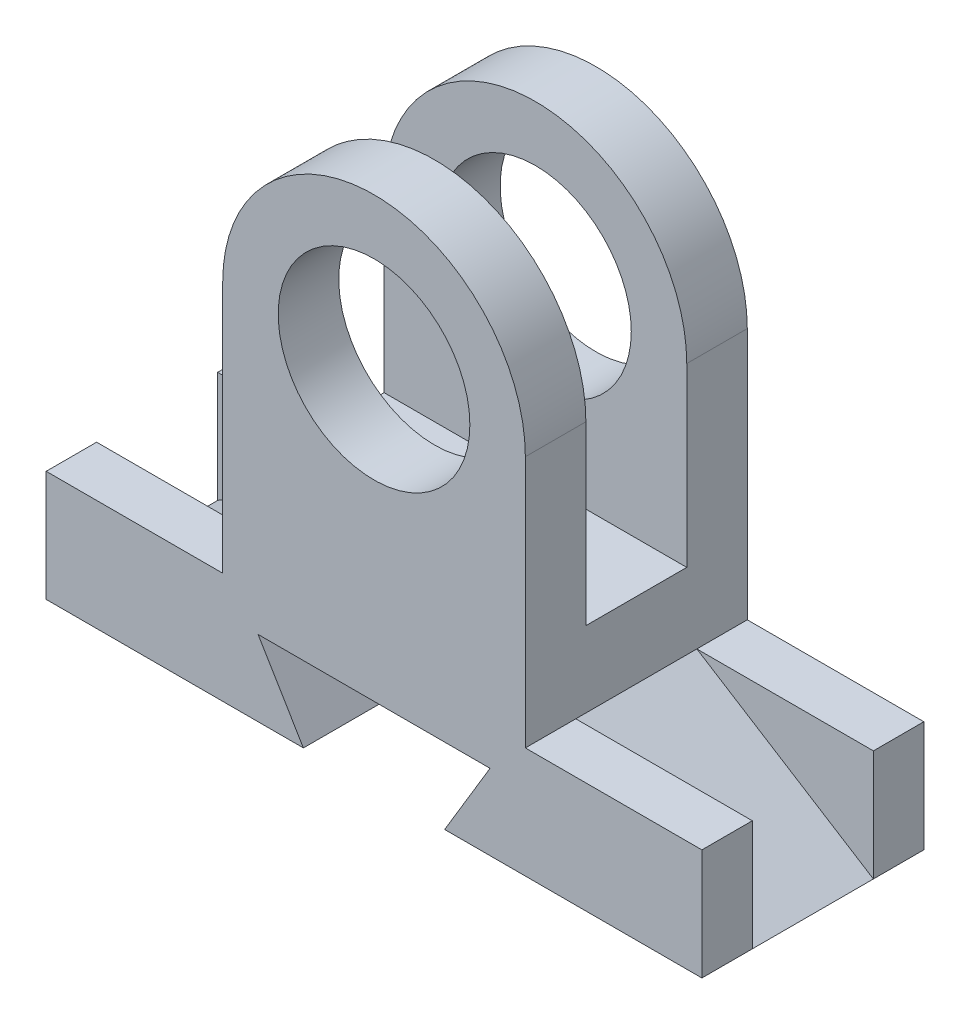
ISO-10303-21;
HEADER;
FILE_DESCRIPTION(('STEP AP214'),'2;1');
FILE_NAME('part.step','',(''),(''),'','','');
FILE_SCHEMA(('AUTOMOTIVE_DESIGN { 1 0 10303 214 1 1 1 1 }'));
ENDSEC;
DATA;
#1=APPLICATION_CONTEXT('core data for automotive mechanical design processes');
#2=APPLICATION_PROTOCOL_DEFINITION('international standard','automotive_design',2000,#1);
#3=PRODUCT_CONTEXT('',#1,'mechanical');
#4=PRODUCT('Part','Part','',(#3));
#5=PRODUCT_RELATED_PRODUCT_CATEGORY('part','',(#4));
#6=PRODUCT_DEFINITION_FORMATION('','',#4);
#7=PRODUCT_DEFINITION_CONTEXT('part definition',#1,'design');
#8=PRODUCT_DEFINITION('design','',#6,#7);
#9=PRODUCT_DEFINITION_SHAPE('','',#8);
#10=(LENGTH_UNIT() NAMED_UNIT(*) SI_UNIT(.MILLI.,.METRE.));
#11=(NAMED_UNIT(*) PLANE_ANGLE_UNIT() SI_UNIT($,.RADIAN.));
#12=(NAMED_UNIT(*) SI_UNIT($,.STERADIAN.) SOLID_ANGLE_UNIT());
#13=UNCERTAINTY_MEASURE_WITH_UNIT(LENGTH_MEASURE(1.E-05),#10,'distance_accuracy_value','');
#14=(GEOMETRIC_REPRESENTATION_CONTEXT(3) GLOBAL_UNCERTAINTY_ASSIGNED_CONTEXT((#13)) GLOBAL_UNIT_ASSIGNED_CONTEXT((#10,
#11,#12)) REPRESENTATION_CONTEXT('',''));
#15=CARTESIAN_POINT('',(0.,0.,0.));
#16=DIRECTION('',(0.,0.,1.));
#17=DIRECTION('',(1.,0.,0.));
#18=AXIS2_PLACEMENT_3D('',#15,#16,#17);
#19=CARTESIAN_POINT('',(0.,61.,-22.));
#20=DIRECTION('',(0.,0.,1.));
#21=DIRECTION('',(1.,0.,0.));
#22=AXIS2_PLACEMENT_3D('',#19,#20,#21);
#23=CYLINDRICAL_SURFACE('',#22,19.);
#24=CARTESIAN_POINT('',(0.,61.,10.));
#25=DIRECTION('',(0.,0.,1.));
#26=DIRECTION('',(0.,-1.,0.));
#27=AXIS2_PLACEMENT_3D('',#24,#25,#26);
#28=CIRCLE('',#27,19.);
#29=CARTESIAN_POINT('',(0.,42.,10.));
#30=VERTEX_POINT('',#29);
#31=EDGE_CURVE('E237',#30,#30,#28,.F.);
#32=ORIENTED_EDGE('',*,*,#31,.T.);
#33=EDGE_LOOP('',(#32));
#34=FACE_BOUND('',#33,.T.);
#35=CARTESIAN_POINT('',(0.,61.,22.));
#36=DIRECTION('',(0.,0.,1.));
#37=DIRECTION('',(1.,0.,0.));
#38=AXIS2_PLACEMENT_3D('',#35,#36,#37);
#39=CIRCLE('',#38,19.);
#40=CARTESIAN_POINT('',(19.,61.,22.));
#41=VERTEX_POINT('',#40);
#42=EDGE_CURVE('E241',#41,#41,#39,.T.);
#43=ORIENTED_EDGE('',*,*,#42,.T.);
#44=EDGE_LOOP('',(#43));
#45=FACE_BOUND('',#44,.T.);
#46=ADVANCED_FACE('F47',(#34,#45),#23,.F.);
#47=CARTESIAN_POINT('',(0.,61.,-22.));
#48=DIRECTION('',(0.,0.,1.));
#49=DIRECTION('',(1.,0.,0.));
#50=AXIS2_PLACEMENT_3D('',#47,#48,#49);
#51=CYLINDRICAL_SURFACE('',#50,30.);
#52=CARTESIAN_POINT('',(0.,61.,10.));
#53=DIRECTION('',(0.,0.,1.));
#54=DIRECTION('',(0.,-1.,0.));
#55=AXIS2_PLACEMENT_3D('',#52,#53,#54);
#56=CIRCLE('',#55,30.);
#57=CARTESIAN_POINT('',(-30.,61.,10.));
#58=VERTEX_POINT('',#57);
#59=CARTESIAN_POINT('',(30.,61.,10.));
#60=VERTEX_POINT('',#59);
#61=EDGE_CURVE('E56',#58,#60,#56,.F.);
#62=ORIENTED_EDGE('',*,*,#61,.F.);
#63=DIRECTION('',(0.,0.,1.));
#64=VECTOR('',#63,1.);
#65=CARTESIAN_POINT('',(-30.,61.,-22.));
#66=LINE('',#65,#64);
#67=CARTESIAN_POINT('',(-30.,61.,22.));
#68=VERTEX_POINT('',#67);
#69=EDGE_CURVE('E287',#58,#68,#66,.T.);
#70=ORIENTED_EDGE('',*,*,#69,.T.);
#71=CARTESIAN_POINT('',(0.,61.,22.));
#72=DIRECTION('',(0.,0.,1.));
#73=DIRECTION('',(1.,0.,0.));
#74=AXIS2_PLACEMENT_3D('',#71,#72,#73);
#75=CIRCLE('',#74,30.);
#76=CARTESIAN_POINT('',(30.,61.,22.));
#77=VERTEX_POINT('',#76);
#78=EDGE_CURVE('E249',#77,#68,#75,.T.);
#79=ORIENTED_EDGE('',*,*,#78,.F.);
#80=DIRECTION('',(0.,0.,1.));
#81=VECTOR('',#80,1.);
#82=CARTESIAN_POINT('',(30.,61.,-22.));
#83=LINE('',#82,#81);
#84=EDGE_CURVE('E273',#60,#77,#83,.T.);
#85=ORIENTED_EDGE('',*,*,#84,.F.);
#86=EDGE_LOOP('',(#62,#70,#79,#85));
#87=FACE_BOUND('',#86,.T.);
#88=ADVANCED_FACE('F462',(#87),#51,.T.);
#89=CARTESIAN_POINT('',(0.,11.,-22.));
#90=DIRECTION('',(0.,-1.,0.));
#91=DIRECTION('',(0.,0.,-1.));
#92=AXIS2_PLACEMENT_3D('',#89,#90,#91);
#93=PLANE('',#92);
#94=DIRECTION('',(1.,0.,0.));
#95=VECTOR('',#94,1.);
#96=CARTESIAN_POINT('',(0.,11.,-22.));
#97=LINE('',#96,#95);
#98=CARTESIAN_POINT('',(30.,11.,-22.));
#99=VERTEX_POINT('',#98);
#100=CARTESIAN_POINT('',(65.,11.,-22.));
#101=VERTEX_POINT('',#100);
#102=EDGE_CURVE('E381',#99,#101,#97,.T.);
#103=ORIENTED_EDGE('',*,*,#102,.F.);
#104=DIRECTION('',(0.,0.,1.));
#105=VECTOR('',#104,1.);
#106=CARTESIAN_POINT('',(30.,11.,-22.));
#107=LINE('',#106,#105);
#108=CARTESIAN_POINT('',(30.,11.,-12.));
#109=VERTEX_POINT('',#108);
#110=EDGE_CURVE('E274',#99,#109,#107,.T.);
#111=ORIENTED_EDGE('',*,*,#110,.T.);
#112=DIRECTION('',(1.,0.,0.));
#113=VECTOR('',#112,1.);
#114=CARTESIAN_POINT('',(0.,11.,-12.));
#115=LINE('',#114,#113);
#116=CARTESIAN_POINT('',(65.,11.,-12.));
#117=VERTEX_POINT('',#116);
#118=EDGE_CURVE('E301',#109,#117,#115,.T.);
#119=ORIENTED_EDGE('',*,*,#118,.T.);
#120=DIRECTION('',(0.,0.,1.));
#121=VECTOR('',#120,1.);
#122=CARTESIAN_POINT('',(65.,11.,-22.));
#123=LINE('',#122,#121);
#124=EDGE_CURVE('E413',#101,#117,#123,.T.);
#125=ORIENTED_EDGE('',*,*,#124,.F.);
#126=EDGE_LOOP('',(#103,#111,#119,#125));
#127=FACE_BOUND('',#126,.T.);
#128=ADVANCED_FACE('F486',(#127),#93,.F.);
#129=DIRECTION('',(0.,0.,1.));
#130=VECTOR('',#129,1.);
#131=CARTESIAN_POINT('',(-30.,11.,-22.));
#132=LINE('',#131,#130);
#133=CARTESIAN_POINT('',(-30.,11.,-22.));
#134=VERTEX_POINT('',#133);
#135=CARTESIAN_POINT('',(-30.,11.,-12.));
#136=VERTEX_POINT('',#135);
#137=EDGE_CURVE('E278',#134,#136,#132,.T.);
#138=ORIENTED_EDGE('',*,*,#137,.F.);
#139=CARTESIAN_POINT('',(-65.,11.,-22.));
#140=VERTEX_POINT('',#139);
#141=EDGE_CURVE('E382',#140,#134,#97,.T.);
#142=ORIENTED_EDGE('',*,*,#141,.F.);
#143=DIRECTION('',(0.,0.,1.));
#144=VECTOR('',#143,1.);
#145=CARTESIAN_POINT('',(-65.,11.,-22.));
#146=LINE('',#145,#144);
#147=CARTESIAN_POINT('',(-65.,11.,-12.));
#148=VERTEX_POINT('',#147);
#149=EDGE_CURVE('E440',#140,#148,#146,.T.);
#150=ORIENTED_EDGE('',*,*,#149,.T.);
#151=DIRECTION('',(1.,0.,0.));
#152=VECTOR('',#151,1.);
#153=CARTESIAN_POINT('',(0.,11.,-12.));
#154=LINE('',#153,#152);
#155=EDGE_CURVE('E327',#148,#136,#154,.T.);
#156=ORIENTED_EDGE('',*,*,#155,.T.);
#157=EDGE_LOOP('',(#138,#142,#150,#156));
#158=FACE_BOUND('',#157,.T.);
#159=ADVANCED_FACE('F540',(#158),#93,.F.);
#160=CARTESIAN_POINT('',(-30.,11.,12.));
#161=VERTEX_POINT('',#160);
#162=CARTESIAN_POINT('',(-30.,11.,22.));
#163=VERTEX_POINT('',#162);
#164=EDGE_CURVE('E283',#161,#163,#132,.T.);
#165=ORIENTED_EDGE('',*,*,#164,.F.);
#166=DIRECTION('',(1.,0.,0.));
#167=VECTOR('',#166,1.);
#168=CARTESIAN_POINT('',(0.,11.,12.));
#169=LINE('',#168,#167);
#170=CARTESIAN_POINT('',(-65.,11.,12.));
#171=VERTEX_POINT('',#170);
#172=EDGE_CURVE('E338',#171,#161,#169,.T.);
#173=ORIENTED_EDGE('',*,*,#172,.F.);
#174=CARTESIAN_POINT('',(-65.,11.,22.));
#175=VERTEX_POINT('',#174);
#176=EDGE_CURVE('E412',#171,#175,#146,.T.);
#177=ORIENTED_EDGE('',*,*,#176,.T.);
#178=DIRECTION('',(1.,0.,0.));
#179=VECTOR('',#178,1.);
#180=CARTESIAN_POINT('',(0.,11.,22.));
#181=LINE('',#180,#179);
#182=EDGE_CURVE('E350',#175,#163,#181,.T.);
#183=ORIENTED_EDGE('',*,*,#182,.T.);
#184=EDGE_LOOP('',(#165,#173,#177,#183));
#185=FACE_BOUND('',#184,.T.);
#186=ADVANCED_FACE('F624',(#185),#93,.F.);
#187=DIRECTION('',(1.,0.,0.));
#188=VECTOR('',#187,1.);
#189=CARTESIAN_POINT('',(0.,11.,12.));
#190=LINE('',#189,#188);
#191=CARTESIAN_POINT('',(30.,11.,12.));
#192=VERTEX_POINT('',#191);
#193=CARTESIAN_POINT('',(65.,11.,12.));
#194=VERTEX_POINT('',#193);
#195=EDGE_CURVE('E277',#192,#194,#190,.T.);
#196=ORIENTED_EDGE('',*,*,#195,.F.);
#197=CARTESIAN_POINT('',(30.,11.,22.));
#198=VERTEX_POINT('',#197);
#199=EDGE_CURVE('E71',#192,#198,#107,.T.);
#200=ORIENTED_EDGE('',*,*,#199,.T.);
#201=CARTESIAN_POINT('',(65.,11.,22.));
#202=VERTEX_POINT('',#201);
#203=EDGE_CURVE('E349',#198,#202,#181,.T.);
#204=ORIENTED_EDGE('',*,*,#203,.T.);
#205=EDGE_CURVE('E417',#194,#202,#123,.T.);
#206=ORIENTED_EDGE('',*,*,#205,.F.);
#207=EDGE_LOOP('',(#196,#200,#204,#206));
#208=FACE_BOUND('',#207,.T.);
#209=ADVANCED_FACE('F49',(#208),#93,.F.);
#210=CARTESIAN_POINT('',(65.,0.,-22.));
#211=DIRECTION('',(1.,0.,0.));
#212=DIRECTION('',(0.,0.,-1.));
#213=AXIS2_PLACEMENT_3D('',#210,#211,#212);
#214=PLANE('',#213);
#215=ORIENTED_EDGE('',*,*,#124,.T.);
#216=DIRECTION('',(0.,1.,0.));
#217=VECTOR('',#216,1.);
#218=CARTESIAN_POINT('',(65.,0.,-12.));
#219=LINE('',#218,#217);
#220=CARTESIAN_POINT('',(65.,-11.,-12.));
#221=VERTEX_POINT('',#220);
#222=EDGE_CURVE('E309',#221,#117,#219,.T.);
#223=ORIENTED_EDGE('',*,*,#222,.F.);
#224=DIRECTION('',(0.,0.,1.));
#225=VECTOR('',#224,1.);
#226=CARTESIAN_POINT('',(65.,-11.,-22.));
#227=LINE('',#226,#225);
#228=CARTESIAN_POINT('',(65.,-11.,-22.));
#229=VERTEX_POINT('',#228);
#230=EDGE_CURVE('E418',#229,#221,#227,.T.);
#231=ORIENTED_EDGE('',*,*,#230,.F.);
#232=DIRECTION('',(0.,1.,0.));
#233=VECTOR('',#232,1.);
#234=CARTESIAN_POINT('',(65.,0.,-22.));
#235=LINE('',#234,#233);
#236=EDGE_CURVE('E408',#229,#101,#235,.T.);
#237=ORIENTED_EDGE('',*,*,#236,.T.);
#238=EDGE_LOOP('',(#215,#223,#231,#237));
#239=FACE_BOUND('',#238,.T.);
#240=ADVANCED_FACE('F492',(#239),#214,.T.);
#241=CARTESIAN_POINT('',(-65.,0.,-22.));
#242=DIRECTION('',(1.,0.,0.));
#243=DIRECTION('',(0.,0.,-1.));
#244=AXIS2_PLACEMENT_3D('',#241,#242,#243);
#245=PLANE('',#244);
#246=DIRECTION('',(0.,1.,0.));
#247=VECTOR('',#246,1.);
#248=CARTESIAN_POINT('',(-65.,0.,-12.));
#249=LINE('',#248,#247);
#250=CARTESIAN_POINT('',(-65.,-11.,-12.));
#251=VERTEX_POINT('',#250);
#252=EDGE_CURVE('E317',#251,#148,#249,.T.);
#253=ORIENTED_EDGE('',*,*,#252,.T.);
#254=ORIENTED_EDGE('',*,*,#149,.F.);
#255=DIRECTION('',(0.,1.,0.));
#256=VECTOR('',#255,1.);
#257=CARTESIAN_POINT('',(-65.,0.,-22.));
#258=LINE('',#257,#256);
#259=CARTESIAN_POINT('',(-65.,-11.,-22.));
#260=VERTEX_POINT('',#259);
#261=EDGE_CURVE('E386',#260,#140,#258,.T.);
#262=ORIENTED_EDGE('',*,*,#261,.F.);
#263=DIRECTION('',(0.,0.,1.));
#264=VECTOR('',#263,1.);
#265=CARTESIAN_POINT('',(-65.,-11.,-22.));
#266=LINE('',#265,#264);
#267=EDGE_CURVE('E435',#260,#251,#266,.T.);
#268=ORIENTED_EDGE('',*,*,#267,.T.);
#269=EDGE_LOOP('',(#253,#254,#262,#268));
#270=FACE_BOUND('',#269,.T.);
#271=ADVANCED_FACE('F537',(#270),#245,.F.);
#272=DIRECTION('',(0.,1.,0.));
#273=VECTOR('',#272,1.);
#274=CARTESIAN_POINT('',(65.,0.,12.));
#275=LINE('',#274,#273);
#276=CARTESIAN_POINT('',(65.,-11.,12.));
#277=VERTEX_POINT('',#276);
#278=EDGE_CURVE('E297',#277,#194,#275,.T.);
#279=ORIENTED_EDGE('',*,*,#278,.T.);
#280=ORIENTED_EDGE('',*,*,#205,.T.);
#281=DIRECTION('',(0.,1.,0.));
#282=VECTOR('',#281,1.);
#283=CARTESIAN_POINT('',(65.,0.,22.));
#284=LINE('',#283,#282);
#285=CARTESIAN_POINT('',(65.,-11.,22.));
#286=VERTEX_POINT('',#285);
#287=EDGE_CURVE('E377',#286,#202,#284,.T.);
#288=ORIENTED_EDGE('',*,*,#287,.F.);
#289=EDGE_CURVE('E422',#277,#286,#227,.T.);
#290=ORIENTED_EDGE('',*,*,#289,.F.);
#291=EDGE_LOOP('',(#279,#280,#288,#290));
#292=FACE_BOUND('',#291,.T.);
#293=ADVANCED_FACE('F472',(#292),#214,.T.);
#294=CARTESIAN_POINT('',(0.,-11.,-22.));
#295=DIRECTION('',(0.,-1.,0.));
#296=DIRECTION('',(0.,0.,-1.));
#297=AXIS2_PLACEMENT_3D('',#294,#295,#296);
#298=PLANE('',#297);
#299=ORIENTED_EDGE('',*,*,#230,.T.);
#300=DIRECTION('',(0.,0.,1.));
#301=VECTOR('',#300,1.);
#302=CARTESIAN_POINT('',(65.,-11.,-12.));
#303=LINE('',#302,#301);
#304=EDGE_CURVE('E313',#221,#277,#303,.T.);
#305=ORIENTED_EDGE('',*,*,#304,.T.);
#306=ORIENTED_EDGE('',*,*,#289,.T.);
#307=DIRECTION('',(1.,0.,0.));
#308=VECTOR('',#307,1.);
#309=CARTESIAN_POINT('',(0.,-11.,22.));
#310=LINE('',#309,#308);
#311=CARTESIAN_POINT('',(14.,-11.,22.));
#312=VERTEX_POINT('',#311);
#313=EDGE_CURVE('E373',#312,#286,#310,.T.);
#314=ORIENTED_EDGE('',*,*,#313,.F.);
#315=DIRECTION('',(0.,0.,1.));
#316=VECTOR('',#315,1.);
#317=CARTESIAN_POINT('',(14.,-11.,-22.));
#318=LINE('',#317,#316);
#319=CARTESIAN_POINT('',(14.,-11.,-22.));
#320=VERTEX_POINT('',#319);
#321=EDGE_CURVE('E423',#320,#312,#318,.T.);
#322=ORIENTED_EDGE('',*,*,#321,.F.);
#323=DIRECTION('',(1.,0.,0.));
#324=VECTOR('',#323,1.);
#325=CARTESIAN_POINT('',(0.,-11.,-22.));
#326=LINE('',#325,#324);
#327=EDGE_CURVE('E404',#320,#229,#326,.T.);
#328=ORIENTED_EDGE('',*,*,#327,.T.);
#329=EDGE_LOOP('',(#299,#305,#306,#314,#322,#328));
#330=FACE_BOUND('',#329,.T.);
#331=ADVANCED_FACE('F494',(#330),#298,.T.);
#332=CARTESIAN_POINT('',(15.1470588235294,-9.08823529411765,-22.));
#333=DIRECTION('',(-0.857492925712544,0.514495755427526,0.));
#334=DIRECTION('',(-0.514495755427526,-0.857492925712544,0.));
#335=AXIS2_PLACEMENT_3D('',#332,#333,#334);
#336=PLANE('',#335);
#337=ORIENTED_EDGE('',*,*,#321,.T.);
#338=DIRECTION('',(-0.514495755427526,-0.857492925712544,0.));
#339=VECTOR('',#338,1.);
#340=CARTESIAN_POINT('',(15.1470588235294,-9.08823529411765,22.));
#341=LINE('',#340,#339);
#342=CARTESIAN_POINT('',(23.,4.,22.));
#343=VERTEX_POINT('',#342);
#344=EDGE_CURVE('E369',#343,#312,#341,.T.);
#345=ORIENTED_EDGE('',*,*,#344,.F.);
#346=DIRECTION('',(0.,0.,1.));
#347=VECTOR('',#346,1.);
#348=CARTESIAN_POINT('',(23.,4.,-22.));
#349=LINE('',#348,#347);
#350=CARTESIAN_POINT('',(23.,4.,-22.));
#351=VERTEX_POINT('',#350);
#352=EDGE_CURVE('E426',#351,#343,#349,.T.);
#353=ORIENTED_EDGE('',*,*,#352,.F.);
#354=DIRECTION('',(-0.514495755427526,-0.857492925712544,0.));
#355=VECTOR('',#354,1.);
#356=CARTESIAN_POINT('',(15.1470588235294,-9.08823529411765,-22.));
#357=LINE('',#356,#355);
#358=EDGE_CURVE('E400',#351,#320,#357,.T.);
#359=ORIENTED_EDGE('',*,*,#358,.T.);
#360=EDGE_LOOP('',(#337,#345,#353,#359));
#361=FACE_BOUND('',#360,.T.);
#362=ADVANCED_FACE('F532',(#361),#336,.T.);
#363=CARTESIAN_POINT('',(0.,4.,-22.));
#364=DIRECTION('',(0.,-1.,0.));
#365=DIRECTION('',(0.,0.,-1.));
#366=AXIS2_PLACEMENT_3D('',#363,#364,#365);
#367=PLANE('',#366);
#368=ORIENTED_EDGE('',*,*,#352,.T.);
#369=DIRECTION('',(1.,0.,0.));
#370=VECTOR('',#369,1.);
#371=CARTESIAN_POINT('',(0.,4.,22.));
#372=LINE('',#371,#370);
#373=CARTESIAN_POINT('',(-23.,4.,22.));
#374=VERTEX_POINT('',#373);
#375=EDGE_CURVE('E365',#374,#343,#372,.T.);
#376=ORIENTED_EDGE('',*,*,#375,.F.);
#377=DIRECTION('',(0.,0.,1.));
#378=VECTOR('',#377,1.);
#379=CARTESIAN_POINT('',(-23.,4.,-22.));
#380=LINE('',#379,#378);
#381=CARTESIAN_POINT('',(-23.,4.,-22.));
#382=VERTEX_POINT('',#381);
#383=EDGE_CURVE('E429',#382,#374,#380,.T.);
#384=ORIENTED_EDGE('',*,*,#383,.F.);
#385=DIRECTION('',(1.,0.,0.));
#386=VECTOR('',#385,1.);
#387=CARTESIAN_POINT('',(0.,4.,-22.));
#388=LINE('',#387,#386);
#389=EDGE_CURVE('E396',#382,#351,#388,.T.);
#390=ORIENTED_EDGE('',*,*,#389,.T.);
#391=EDGE_LOOP('',(#368,#376,#384,#390));
#392=FACE_BOUND('',#391,.T.);
#393=ADVANCED_FACE('F529',(#392),#367,.T.);
#394=CARTESIAN_POINT('',(-15.1470588235294,-9.08823529411765,-22.));
#395=DIRECTION('',(-0.857492925712544,-0.514495755427526,0.));
#396=DIRECTION('',(0.514495755427526,-0.857492925712544,0.));
#397=AXIS2_PLACEMENT_3D('',#394,#395,#396);
#398=PLANE('',#397);
#399=ORIENTED_EDGE('',*,*,#383,.T.);
#400=DIRECTION('',(0.514495755427526,-0.857492925712544,0.));
#401=VECTOR('',#400,1.);
#402=CARTESIAN_POINT('',(-15.1470588235294,-9.08823529411765,22.));
#403=LINE('',#402,#401);
#404=CARTESIAN_POINT('',(-14.,-11.,22.));
#405=VERTEX_POINT('',#404);
#406=EDGE_CURVE('E361',#374,#405,#403,.T.);
#407=ORIENTED_EDGE('',*,*,#406,.T.);
#408=DIRECTION('',(0.,0.,1.));
#409=VECTOR('',#408,1.);
#410=CARTESIAN_POINT('',(-14.,-11.,-22.));
#411=LINE('',#410,#409);
#412=CARTESIAN_POINT('',(-14.,-11.,-22.));
#413=VERTEX_POINT('',#412);
#414=EDGE_CURVE('E432',#413,#405,#411,.T.);
#415=ORIENTED_EDGE('',*,*,#414,.F.);
#416=DIRECTION('',(0.514495755427526,-0.857492925712544,0.));
#417=VECTOR('',#416,1.);
#418=CARTESIAN_POINT('',(-15.1470588235294,-9.08823529411765,-22.));
#419=LINE('',#418,#417);
#420=EDGE_CURVE('E393',#382,#413,#419,.T.);
#421=ORIENTED_EDGE('',*,*,#420,.F.);
#422=EDGE_LOOP('',(#399,#407,#415,#421));
#423=FACE_BOUND('',#422,.T.);
#424=ADVANCED_FACE('F524',(#423),#398,.F.);
#425=CARTESIAN_POINT('',(0.,-11.,-22.));
#426=DIRECTION('',(0.,-1.,0.));
#427=DIRECTION('',(0.,0.,-1.));
#428=AXIS2_PLACEMENT_3D('',#425,#426,#427);
#429=PLANE('',#428);
#430=ORIENTED_EDGE('',*,*,#414,.T.);
#431=DIRECTION('',(1.,0.,0.));
#432=VECTOR('',#431,1.);
#433=CARTESIAN_POINT('',(0.,-11.,22.));
#434=LINE('',#433,#432);
#435=CARTESIAN_POINT('',(-65.,-11.,22.));
#436=VERTEX_POINT('',#435);
#437=EDGE_CURVE('E357',#436,#405,#434,.T.);
#438=ORIENTED_EDGE('',*,*,#437,.F.);
#439=CARTESIAN_POINT('',(-65.,-11.,12.));
#440=VERTEX_POINT('',#439);
#441=EDGE_CURVE('E439',#440,#436,#266,.T.);
#442=ORIENTED_EDGE('',*,*,#441,.F.);
#443=DIRECTION('',(0.,0.,-1.));
#444=VECTOR('',#443,1.);
#445=CARTESIAN_POINT('',(-65.,-11.,12.));
#446=LINE('',#445,#444);
#447=EDGE_CURVE('E345',#440,#251,#446,.T.);
#448=ORIENTED_EDGE('',*,*,#447,.T.);
#449=ORIENTED_EDGE('',*,*,#267,.F.);
#450=DIRECTION('',(1.,0.,0.));
#451=VECTOR('',#450,1.);
#452=CARTESIAN_POINT('',(0.,-11.,-22.));
#453=LINE('',#452,#451);
#454=EDGE_CURVE('E389',#260,#413,#453,.T.);
#455=ORIENTED_EDGE('',*,*,#454,.T.);
#456=EDGE_LOOP('',(#430,#438,#442,#448,#449,#455));
#457=FACE_BOUND('',#456,.T.);
#458=ADVANCED_FACE('F520',(#457),#429,.T.);
#459=ORIENTED_EDGE('',*,*,#176,.F.);
#460=DIRECTION('',(0.,1.,0.));
#461=VECTOR('',#460,1.);
#462=CARTESIAN_POINT('',(-65.,0.,12.));
#463=LINE('',#462,#461);
#464=EDGE_CURVE('E331',#440,#171,#463,.T.);
#465=ORIENTED_EDGE('',*,*,#464,.F.);
#466=ORIENTED_EDGE('',*,*,#441,.T.);
#467=DIRECTION('',(0.,1.,0.));
#468=VECTOR('',#467,1.);
#469=CARTESIAN_POINT('',(-65.,0.,22.));
#470=LINE('',#469,#468);
#471=EDGE_CURVE('E353',#436,#175,#470,.T.);
#472=ORIENTED_EDGE('',*,*,#471,.T.);
#473=EDGE_LOOP('',(#459,#465,#466,#472));
#474=FACE_BOUND('',#473,.T.);
#475=ADVANCED_FACE('F515',(#474),#245,.F.);
#476=CARTESIAN_POINT('',(0.,0.,-22.));
#477=DIRECTION('',(0.,0.,1.));
#478=DIRECTION('',(1.,0.,0.));
#479=AXIS2_PLACEMENT_3D('',#476,#477,#478);
#480=PLANE('',#479);
#481=ORIENTED_EDGE('',*,*,#141,.T.);
#482=DIRECTION('',(0.,-1.,0.));
#483=VECTOR('',#482,1.);
#484=CARTESIAN_POINT('',(-30.,0.,-22.));
#485=LINE('',#484,#483);
#486=CARTESIAN_POINT('',(-30.,61.,-22.));
#487=VERTEX_POINT('',#486);
#488=EDGE_CURVE('E269',#487,#134,#485,.T.);
#489=ORIENTED_EDGE('',*,*,#488,.F.);
#490=CARTESIAN_POINT('',(0.,61.,-22.));
#491=DIRECTION('',(0.,0.,1.));
#492=DIRECTION('',(1.,0.,0.));
#493=AXIS2_PLACEMENT_3D('',#490,#491,#492);
#494=CIRCLE('',#493,30.);
#495=CARTESIAN_POINT('',(30.,61.,-22.));
#496=VERTEX_POINT('',#495);
#497=EDGE_CURVE('E265',#496,#487,#494,.T.);
#498=ORIENTED_EDGE('',*,*,#497,.F.);
#499=DIRECTION('',(0.,-1.,0.));
#500=VECTOR('',#499,1.);
#501=CARTESIAN_POINT('',(30.,0.,-22.));
#502=LINE('',#501,#500);
#503=EDGE_CURVE('E261',#496,#99,#502,.T.);
#504=ORIENTED_EDGE('',*,*,#503,.T.);
#505=ORIENTED_EDGE('',*,*,#102,.T.);
#506=ORIENTED_EDGE('',*,*,#236,.F.);
#507=ORIENTED_EDGE('',*,*,#327,.F.);
#508=ORIENTED_EDGE('',*,*,#358,.F.);
#509=ORIENTED_EDGE('',*,*,#389,.F.);
#510=ORIENTED_EDGE('',*,*,#420,.T.);
#511=ORIENTED_EDGE('',*,*,#454,.F.);
#512=ORIENTED_EDGE('',*,*,#261,.T.);
#513=EDGE_LOOP('',(#481,#489,#498,#504,#505,#506,#507,#508,#509,#510,#511,#512));
#514=FACE_BOUND('',#513,.T.);
#515=CARTESIAN_POINT('',(0.,61.,-22.));
#516=DIRECTION('',(0.,0.,1.));
#517=DIRECTION('',(1.,0.,0.));
#518=AXIS2_PLACEMENT_3D('',#515,#516,#517);
#519=CIRCLE('',#518,19.);
#520=CARTESIAN_POINT('',(19.,61.,-22.));
#521=VERTEX_POINT('',#520);
#522=EDGE_CURVE('E257',#521,#521,#519,.T.);
#523=ORIENTED_EDGE('',*,*,#522,.T.);
#524=EDGE_LOOP('',(#523));
#525=FACE_BOUND('',#524,.T.);
#526=ADVANCED_FACE('F500',(#514,#525),#480,.F.);
#527=CARTESIAN_POINT('',(0.,0.,22.));
#528=DIRECTION('',(0.,0.,1.));
#529=DIRECTION('',(1.,0.,0.));
#530=AXIS2_PLACEMENT_3D('',#527,#528,#529);
#531=PLANE('',#530);
#532=ORIENTED_EDGE('',*,*,#182,.F.);
#533=ORIENTED_EDGE('',*,*,#471,.F.);
#534=ORIENTED_EDGE('',*,*,#437,.T.);
#535=ORIENTED_EDGE('',*,*,#406,.F.);
#536=ORIENTED_EDGE('',*,*,#375,.T.);
#537=ORIENTED_EDGE('',*,*,#344,.T.);
#538=ORIENTED_EDGE('',*,*,#313,.T.);
#539=ORIENTED_EDGE('',*,*,#287,.T.);
#540=ORIENTED_EDGE('',*,*,#203,.F.);
#541=DIRECTION('',(0.,-1.,0.));
#542=VECTOR('',#541,1.);
#543=CARTESIAN_POINT('',(30.,0.,22.));
#544=LINE('',#543,#542);
#545=EDGE_CURVE('E245',#77,#198,#544,.T.);
#546=ORIENTED_EDGE('',*,*,#545,.F.);
#547=ORIENTED_EDGE('',*,*,#78,.T.);
#548=DIRECTION('',(0.,-1.,0.));
#549=VECTOR('',#548,1.);
#550=CARTESIAN_POINT('',(-30.,0.,22.));
#551=LINE('',#550,#549);
#552=EDGE_CURVE('E253',#68,#163,#551,.T.);
#553=ORIENTED_EDGE('',*,*,#552,.T.);
#554=EDGE_LOOP('',(#532,#533,#534,#535,#536,#537,#538,#539,#540,#546,#547,#553));
#555=FACE_BOUND('',#554,.T.);
#556=ORIENTED_EDGE('',*,*,#42,.F.);
#557=EDGE_LOOP('',(#556));
#558=FACE_BOUND('',#557,.T.);
#559=ADVANCED_FACE('F467',(#555,#558),#531,.T.);
#560=CARTESIAN_POINT('',(-13.4523112931539,21.4014043300176,12.));
#561=DIRECTION('',(-0.532171545218346,0.846636549211005,0.));
#562=DIRECTION('',(-0.846636549211005,-0.532171545218346,0.));
#563=AXIS2_PLACEMENT_3D('',#560,#561,#562);
#564=PLANE('',#563);
#565=ORIENTED_EDGE('',*,*,#447,.F.);
#566=DIRECTION('',(0.846636549211005,0.532171545218346,0.));
#567=VECTOR('',#566,1.);
#568=CARTESIAN_POINT('',(-13.4523112931539,21.4014043300176,12.));
#569=LINE('',#568,#567);
#570=EDGE_CURVE('E334',#440,#161,#569,.T.);
#571=ORIENTED_EDGE('',*,*,#570,.T.);
#572=DIRECTION('',(0.,0.,-1.));
#573=VECTOR('',#572,1.);
#574=CARTESIAN_POINT('',(-30.,11.,12.));
#575=LINE('',#574,#573);
#576=EDGE_CURVE('E342',#161,#136,#575,.T.);
#577=ORIENTED_EDGE('',*,*,#576,.T.);
#578=DIRECTION('',(0.846636549211005,0.532171545218346,0.));
#579=VECTOR('',#578,1.);
#580=CARTESIAN_POINT('',(-13.4523112931539,21.4014043300176,-12.));
#581=LINE('',#580,#579);
#582=EDGE_CURVE('E323',#251,#136,#581,.T.);
#583=ORIENTED_EDGE('',*,*,#582,.F.);
#584=EDGE_LOOP('',(#565,#571,#577,#583));
#585=FACE_BOUND('',#584,.T.);
#586=ADVANCED_FACE('F543',(#585),#564,.T.);
#587=CARTESIAN_POINT('',(0.,0.,12.));
#588=DIRECTION('',(0.,0.,1.));
#589=DIRECTION('',(1.,0.,0.));
#590=AXIS2_PLACEMENT_3D('',#587,#588,#589);
#591=PLANE('',#590);
#592=ORIENTED_EDGE('',*,*,#464,.T.);
#593=ORIENTED_EDGE('',*,*,#172,.T.);
#594=ORIENTED_EDGE('',*,*,#570,.F.);
#595=EDGE_LOOP('',(#592,#593,#594));
#596=FACE_BOUND('',#595,.T.);
#597=ADVANCED_FACE('F548',(#596),#591,.F.);
#598=CARTESIAN_POINT('',(0.,0.,-12.));
#599=DIRECTION('',(0.,0.,1.));
#600=DIRECTION('',(1.,0.,0.));
#601=AXIS2_PLACEMENT_3D('',#598,#599,#600);
#602=PLANE('',#601);
#603=ORIENTED_EDGE('',*,*,#252,.F.);
#604=ORIENTED_EDGE('',*,*,#582,.T.);
#605=ORIENTED_EDGE('',*,*,#155,.F.);
#606=EDGE_LOOP('',(#603,#604,#605));
#607=FACE_BOUND('',#606,.T.);
#608=ADVANCED_FACE('F546',(#607),#602,.T.);
#609=CARTESIAN_POINT('',(13.4523112931539,21.4014043300176,-12.));
#610=DIRECTION('',(-0.532171545218346,-0.846636549211005,0.));
#611=DIRECTION('',(0.846636549211005,-0.532171545218346,0.));
#612=AXIS2_PLACEMENT_3D('',#609,#610,#611);
#613=PLANE('',#612);
#614=ORIENTED_EDGE('',*,*,#304,.F.);
#615=DIRECTION('',(0.846636549211005,-0.532171545218346,0.));
#616=VECTOR('',#615,1.);
#617=CARTESIAN_POINT('',(13.4523112931539,21.4014043300176,-12.));
#618=LINE('',#617,#616);
#619=EDGE_CURVE('E305',#109,#221,#618,.T.);
#620=ORIENTED_EDGE('',*,*,#619,.F.);
#621=DIRECTION('',(0.,0.,1.));
#622=VECTOR('',#621,1.);
#623=CARTESIAN_POINT('',(30.,11.,-12.));
#624=LINE('',#623,#622);
#625=EDGE_CURVE('E312',#109,#192,#624,.T.);
#626=ORIENTED_EDGE('',*,*,#625,.T.);
#627=DIRECTION('',(0.846636549211005,-0.532171545218346,0.));
#628=VECTOR('',#627,1.);
#629=CARTESIAN_POINT('',(13.4523112931539,21.4014043300176,12.));
#630=LINE('',#629,#628);
#631=EDGE_CURVE('E293',#192,#277,#630,.T.);
#632=ORIENTED_EDGE('',*,*,#631,.T.);
#633=EDGE_LOOP('',(#614,#620,#626,#632));
#634=FACE_BOUND('',#633,.T.);
#635=ADVANCED_FACE('F478',(#634),#613,.F.);
#636=CARTESIAN_POINT('',(0.,0.,-12.));
#637=DIRECTION('',(0.,0.,1.));
#638=DIRECTION('',(1.,0.,0.));
#639=AXIS2_PLACEMENT_3D('',#636,#637,#638);
#640=PLANE('',#639);
#641=ORIENTED_EDGE('',*,*,#118,.F.);
#642=ORIENTED_EDGE('',*,*,#619,.T.);
#643=ORIENTED_EDGE('',*,*,#222,.T.);
#644=EDGE_LOOP('',(#641,#642,#643));
#645=FACE_BOUND('',#644,.T.);
#646=ADVANCED_FACE('F489',(#645),#640,.T.);
#647=CARTESIAN_POINT('',(0.,0.,12.));
#648=DIRECTION('',(0.,0.,1.));
#649=DIRECTION('',(1.,0.,0.));
#650=AXIS2_PLACEMENT_3D('',#647,#648,#649);
#651=PLANE('',#650);
#652=ORIENTED_EDGE('',*,*,#195,.T.);
#653=ORIENTED_EDGE('',*,*,#278,.F.);
#654=ORIENTED_EDGE('',*,*,#631,.F.);
#655=EDGE_LOOP('',(#652,#653,#654));
#656=FACE_BOUND('',#655,.T.);
#657=ADVANCED_FACE('F476',(#656),#651,.F.);
#658=CARTESIAN_POINT('',(30.,0.,-22.));
#659=DIRECTION('',(-1.,0.,0.));
#660=DIRECTION('',(0.,-1.,0.));
#661=AXIS2_PLACEMENT_3D('',#658,#659,#660);
#662=PLANE('',#661);
#663=DIRECTION('',(0.,0.,-1.));
#664=VECTOR('',#663,1.);
#665=CARTESIAN_POINT('',(30.,26.,10.));
#666=LINE('',#665,#664);
#667=CARTESIAN_POINT('',(30.,26.,10.));
#668=VERTEX_POINT('',#667);
#669=CARTESIAN_POINT('',(30.,26.,-10.));
#670=VERTEX_POINT('',#669);
#671=EDGE_CURVE('E202',#668,#670,#666,.T.);
#672=ORIENTED_EDGE('',*,*,#671,.F.);
#673=DIRECTION('',(0.,-1.,0.));
#674=VECTOR('',#673,1.);
#675=CARTESIAN_POINT('',(30.,97.3196497420588,10.));
#676=LINE('',#675,#674);
#677=EDGE_CURVE('E210',#60,#668,#676,.T.);
#678=ORIENTED_EDGE('',*,*,#677,.F.);
#679=ORIENTED_EDGE('',*,*,#84,.T.);
#680=ORIENTED_EDGE('',*,*,#545,.T.);
#681=ORIENTED_EDGE('',*,*,#199,.F.);
#682=ORIENTED_EDGE('',*,*,#625,.F.);
#683=ORIENTED_EDGE('',*,*,#110,.F.);
#684=ORIENTED_EDGE('',*,*,#503,.F.);
#685=CARTESIAN_POINT('',(30.,61.,-10.));
#686=VERTEX_POINT('',#685);
#687=EDGE_CURVE('E288',#496,#686,#83,.T.);
#688=ORIENTED_EDGE('',*,*,#687,.T.);
#689=DIRECTION('',(0.,1.,0.));
#690=VECTOR('',#689,1.);
#691=CARTESIAN_POINT('',(30.,97.3196497420588,-10.));
#692=LINE('',#691,#690);
#693=EDGE_CURVE('E63',#670,#686,#692,.T.);
#694=ORIENTED_EDGE('',*,*,#693,.F.);
#695=EDGE_LOOP('',(#672,#678,#679,#680,#681,#682,#683,#684,#688,#694));
#696=FACE_BOUND('',#695,.T.);
#697=ADVANCED_FACE('F218',(#696),#662,.F.);
#698=CARTESIAN_POINT('',(-30.,0.,-22.));
#699=DIRECTION('',(-1.,0.,0.));
#700=DIRECTION('',(0.,-1.,0.));
#701=AXIS2_PLACEMENT_3D('',#698,#699,#700);
#702=PLANE('',#701);
#703=DIRECTION('',(0.,1.,0.));
#704=VECTOR('',#703,1.);
#705=CARTESIAN_POINT('',(-30.,0.,9.99999999999999));
#706=LINE('',#705,#704);
#707=CARTESIAN_POINT('',(-30.,26.,10.));
#708=VERTEX_POINT('',#707);
#709=EDGE_CURVE('E234',#708,#58,#706,.T.);
#710=ORIENTED_EDGE('',*,*,#709,.F.);
#711=DIRECTION('',(0.,0.,1.));
#712=VECTOR('',#711,1.);
#713=CARTESIAN_POINT('',(-30.,26.,-22.));
#714=LINE('',#713,#712);
#715=CARTESIAN_POINT('',(-30.,26.,-10.));
#716=VERTEX_POINT('',#715);
#717=EDGE_CURVE('E11',#716,#708,#714,.T.);
#718=ORIENTED_EDGE('',*,*,#717,.F.);
#719=DIRECTION('',(0.,-1.,0.));
#720=VECTOR('',#719,1.);
#721=CARTESIAN_POINT('',(-30.,0.,-10.));
#722=LINE('',#721,#720);
#723=CARTESIAN_POINT('',(-30.,61.,-10.));
#724=VERTEX_POINT('',#723);
#725=EDGE_CURVE('E226',#724,#716,#722,.T.);
#726=ORIENTED_EDGE('',*,*,#725,.F.);
#727=EDGE_CURVE('E282',#487,#724,#66,.T.);
#728=ORIENTED_EDGE('',*,*,#727,.F.);
#729=ORIENTED_EDGE('',*,*,#488,.T.);
#730=ORIENTED_EDGE('',*,*,#137,.T.);
#731=ORIENTED_EDGE('',*,*,#576,.F.);
#732=ORIENTED_EDGE('',*,*,#164,.T.);
#733=ORIENTED_EDGE('',*,*,#552,.F.);
#734=ORIENTED_EDGE('',*,*,#69,.F.);
#735=EDGE_LOOP('',(#710,#718,#726,#728,#729,#730,#731,#732,#733,#734));
#736=FACE_BOUND('',#735,.T.);
#737=ADVANCED_FACE('F509',(#736),#702,.T.);
#738=CARTESIAN_POINT('',(0.,61.,-10.));
#739=DIRECTION('',(0.,0.,-1.));
#740=DIRECTION('',(0.,1.,0.));
#741=AXIS2_PLACEMENT_3D('',#738,#739,#740);
#742=CIRCLE('',#741,19.);
#743=CARTESIAN_POINT('',(0.,80.,-10.));
#744=VERTEX_POINT('',#743);
#745=EDGE_CURVE('E230',#744,#744,#742,.F.);
#746=ORIENTED_EDGE('',*,*,#745,.T.);
#747=EDGE_LOOP('',(#746));
#748=FACE_BOUND('',#747,.T.);
#749=ORIENTED_EDGE('',*,*,#522,.F.);
#750=EDGE_LOOP('',(#749));
#751=FACE_BOUND('',#750,.T.);
#752=ADVANCED_FACE('F560',(#748,#751),#23,.F.);
#753=CARTESIAN_POINT('',(0.,61.,-10.));
#754=DIRECTION('',(0.,0.,-1.));
#755=DIRECTION('',(0.,1.,0.));
#756=AXIS2_PLACEMENT_3D('',#753,#754,#755);
#757=CIRCLE('',#756,30.);
#758=EDGE_CURVE('E444',#686,#724,#757,.F.);
#759=ORIENTED_EDGE('',*,*,#758,.F.);
#760=ORIENTED_EDGE('',*,*,#687,.F.);
#761=ORIENTED_EDGE('',*,*,#497,.T.);
#762=ORIENTED_EDGE('',*,*,#727,.T.);
#763=EDGE_LOOP('',(#759,#760,#761,#762));
#764=FACE_BOUND('',#763,.T.);
#765=ADVANCED_FACE('F504',(#764),#51,.T.);
#766=CARTESIAN_POINT('',(-65.,97.3196497420588,10.));
#767=DIRECTION('',(0.,0.,1.));
#768=DIRECTION('',(0.,-1.,0.));
#769=AXIS2_PLACEMENT_3D('',#766,#767,#768);
#770=PLANE('',#769);
#771=ORIENTED_EDGE('',*,*,#709,.T.);
#772=ORIENTED_EDGE('',*,*,#61,.T.);
#773=ORIENTED_EDGE('',*,*,#677,.T.);
#774=DIRECTION('',(1.,0.,0.));
#775=VECTOR('',#774,1.);
#776=CARTESIAN_POINT('',(-65.,26.,10.));
#777=LINE('',#776,#775);
#778=EDGE_CURVE('E197',#708,#668,#777,.T.);
#779=ORIENTED_EDGE('',*,*,#778,.F.);
#780=EDGE_LOOP('',(#771,#772,#773,#779));
#781=FACE_BOUND('',#780,.T.);
#782=ORIENTED_EDGE('',*,*,#31,.F.);
#783=EDGE_LOOP('',(#782));
#784=FACE_BOUND('',#783,.T.);
#785=ADVANCED_FACE('F211',(#781,#784),#770,.F.);
#786=CARTESIAN_POINT('',(-65.,97.3196497420588,-10.));
#787=DIRECTION('',(0.,0.,-1.));
#788=DIRECTION('',(0.,1.,0.));
#789=AXIS2_PLACEMENT_3D('',#786,#787,#788);
#790=PLANE('',#789);
#791=ORIENTED_EDGE('',*,*,#725,.T.);
#792=DIRECTION('',(1.,0.,0.));
#793=VECTOR('',#792,1.);
#794=CARTESIAN_POINT('',(-65.,26.,-10.));
#795=LINE('',#794,#793);
#796=EDGE_CURVE('E207',#716,#670,#795,.T.);
#797=ORIENTED_EDGE('',*,*,#796,.T.);
#798=ORIENTED_EDGE('',*,*,#693,.T.);
#799=ORIENTED_EDGE('',*,*,#758,.T.);
#800=EDGE_LOOP('',(#791,#797,#798,#799));
#801=FACE_BOUND('',#800,.T.);
#802=ORIENTED_EDGE('',*,*,#745,.F.);
#803=EDGE_LOOP('',(#802));
#804=FACE_BOUND('',#803,.T.);
#805=ADVANCED_FACE('F506',(#801,#804),#790,.F.);
#806=CARTESIAN_POINT('',(-65.,26.,10.));
#807=DIRECTION('',(0.,-1.,0.));
#808=DIRECTION('',(1.,0.,0.));
#809=AXIS2_PLACEMENT_3D('',#806,#807,#808);
#810=PLANE('',#809);
#811=ORIENTED_EDGE('',*,*,#717,.T.);
#812=ORIENTED_EDGE('',*,*,#778,.T.);
#813=ORIENTED_EDGE('',*,*,#671,.T.);
#814=ORIENTED_EDGE('',*,*,#796,.F.);
#815=EDGE_LOOP('',(#811,#812,#813,#814));
#816=FACE_BOUND('',#815,.T.);
#817=ADVANCED_FACE('F199',(#816),#810,.F.);
#818=CLOSED_SHELL('',(#46,#88,#128,#159,#186,#209,#240,#271,#293,#331,#362,#393,#424,#458,#475,
#526,#559,#586,#597,#608,#635,#646,#657,#697,#737,#752,#765,#785,#805,#817));
#819=MANIFOLD_SOLID_BREP('B2',#818);
#820=ADVANCED_BREP_SHAPE_REPRESENTATION('',(#18,#819),#14);
#821=SHAPE_DEFINITION_REPRESENTATION(#9,#820);
ENDSEC;
END-ISO-10303-21;
